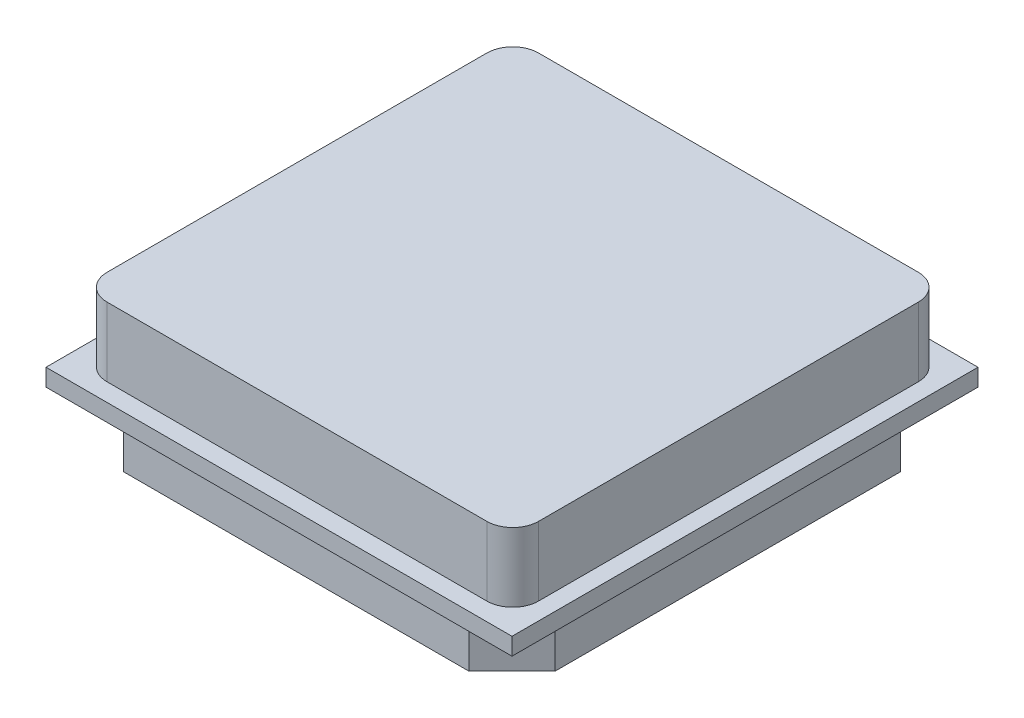
ISO-10303-21;
HEADER;
FILE_DESCRIPTION(('STEP AP214'),'2;1');
FILE_NAME('part.step','',(''),(''),'','','');
FILE_SCHEMA(('AUTOMOTIVE_DESIGN { 1 0 10303 214 1 1 1 1 }'));
ENDSEC;
DATA;
#1=APPLICATION_CONTEXT('core data for automotive mechanical design processes');
#2=APPLICATION_PROTOCOL_DEFINITION('international standard','automotive_design',2000,#1);
#3=PRODUCT_CONTEXT('',#1,'mechanical');
#4=PRODUCT('Part','Part','',(#3));
#5=PRODUCT_RELATED_PRODUCT_CATEGORY('part','',(#4));
#6=PRODUCT_DEFINITION_FORMATION('','',#4);
#7=PRODUCT_DEFINITION_CONTEXT('part definition',#1,'design');
#8=PRODUCT_DEFINITION('design','',#6,#7);
#9=PRODUCT_DEFINITION_SHAPE('','',#8);
#10=(LENGTH_UNIT() NAMED_UNIT(*) SI_UNIT(.MILLI.,.METRE.));
#11=(NAMED_UNIT(*) PLANE_ANGLE_UNIT() SI_UNIT($,.RADIAN.));
#12=(NAMED_UNIT(*) SI_UNIT($,.STERADIAN.) SOLID_ANGLE_UNIT());
#13=UNCERTAINTY_MEASURE_WITH_UNIT(LENGTH_MEASURE(1.E-05),#10,'distance_accuracy_value','');
#14=(GEOMETRIC_REPRESENTATION_CONTEXT(3) GLOBAL_UNCERTAINTY_ASSIGNED_CONTEXT((#13)) GLOBAL_UNIT_ASSIGNED_CONTEXT((#10,
#11,#12)) REPRESENTATION_CONTEXT('',''));
#15=CARTESIAN_POINT('',(0.,0.,0.));
#16=DIRECTION('',(0.,0.,1.));
#17=DIRECTION('',(1.,0.,0.));
#18=AXIS2_PLACEMENT_3D('',#15,#16,#17);
#19=CARTESIAN_POINT('',(-0.757782148578703,17.6518708846178,5.00634006393568));
#20=DIRECTION('',(1.,0.,0.));
#21=DIRECTION('',(0.,0.,-1.));
#22=AXIS2_PLACEMENT_3D('',#19,#20,#21);
#23=PLANE('',#22);
#24=DIRECTION('',(0.,0.,1.));
#25=VECTOR('',#24,1.);
#26=CARTESIAN_POINT('',(-0.757782148578703,17.6518708846178,5.00634006393568));
#27=LINE('',#26,#25);
#28=CARTESIAN_POINT('',(-0.757782148578703,17.6518708846178,6.50634006393568));
#29=VERTEX_POINT('',#28);
#30=CARTESIAN_POINT('',(-0.757782148578703,17.6518708846178,28.5063400639357));
#31=VERTEX_POINT('',#30);
#32=EDGE_CURVE('P0_E102',#29,#31,#27,.T.);
#33=ORIENTED_EDGE('',*,*,#32,.F.);
#34=DIRECTION('',(0.,-1.,0.));
#35=VECTOR('',#34,1.);
#36=CARTESIAN_POINT('',(-0.757782148578703,17.6518708846178,6.50634006393568));
#37=LINE('',#36,#35);
#38=CARTESIAN_POINT('',(-0.757782148578703,13.6518708846178,6.50634006393568));
#39=VERTEX_POINT('',#38);
#40=EDGE_CURVE('P0_E87',#29,#39,#37,.T.);
#41=ORIENTED_EDGE('',*,*,#40,.T.);
#42=DIRECTION('',(0.,0.,1.));
#43=VECTOR('',#42,1.);
#44=CARTESIAN_POINT('',(-0.757782148578703,13.6518708846178,5.00634006393568));
#45=LINE('',#44,#43);
#46=CARTESIAN_POINT('',(-0.757782148578703,13.6518708846178,28.5063400639357));
#47=VERTEX_POINT('',#46);
#48=EDGE_CURVE('P0_E99',#39,#47,#45,.T.);
#49=ORIENTED_EDGE('',*,*,#48,.T.);
#50=DIRECTION('',(0.,-1.,0.));
#51=VECTOR('',#50,1.);
#52=CARTESIAN_POINT('',(-0.757782148578703,17.6518708846178,28.5063400639357));
#53=LINE('',#52,#51);
#54=EDGE_CURVE('P0_E104',#47,#31,#53,.F.);
#55=ORIENTED_EDGE('',*,*,#54,.T.);
#56=EDGE_LOOP('',(#33,#41,#49,#55));
#57=FACE_BOUND('',#56,.T.);
#58=ADVANCED_FACE('P0_F17',(#57),#23,.F.);
#59=CARTESIAN_POINT('',(24.2422178514213,17.6518708846178,30.0063400639357));
#60=DIRECTION('',(0.,0.,-1.));
#61=DIRECTION('',(-1.,0.,0.));
#62=AXIS2_PLACEMENT_3D('',#59,#60,#61);
#63=PLANE('',#62);
#64=DIRECTION('',(1.,0.,0.));
#65=VECTOR('',#64,1.);
#66=CARTESIAN_POINT('',(24.2422178514213,13.6518708846178,30.0063400639357));
#67=LINE('',#66,#65);
#68=CARTESIAN_POINT('',(0.742217851421296,13.6518708846178,30.0063400639357));
#69=VERTEX_POINT('',#68);
#70=CARTESIAN_POINT('',(22.7422178514213,13.6518708846178,30.0063400639357));
#71=VERTEX_POINT('',#70);
#72=EDGE_CURVE('P0_E108',#69,#71,#67,.T.);
#73=ORIENTED_EDGE('',*,*,#72,.T.);
#74=DIRECTION('',(0.,-1.,0.));
#75=VECTOR('',#74,1.);
#76=CARTESIAN_POINT('',(22.7422178514213,17.6518708846178,30.0063400639357));
#77=LINE('',#76,#75);
#78=CARTESIAN_POINT('',(22.7422178514213,17.6518708846178,30.0063400639357));
#79=VERTEX_POINT('',#78);
#80=EDGE_CURVE('P0_E11',#71,#79,#77,.F.);
#81=ORIENTED_EDGE('',*,*,#80,.T.);
#82=DIRECTION('',(1.,0.,0.));
#83=VECTOR('',#82,1.);
#84=CARTESIAN_POINT('',(24.2422178514213,17.6518708846178,30.0063400639357));
#85=LINE('',#84,#83);
#86=CARTESIAN_POINT('',(0.742217851421296,17.6518708846178,30.0063400639357));
#87=VERTEX_POINT('',#86);
#88=EDGE_CURVE('P0_E144',#87,#79,#85,.T.);
#89=ORIENTED_EDGE('',*,*,#88,.F.);
#90=DIRECTION('',(0.,-1.,0.));
#91=VECTOR('',#90,1.);
#92=CARTESIAN_POINT('',(0.742217851421296,17.6518708846178,30.0063400639357));
#93=LINE('',#92,#91);
#94=EDGE_CURVE('P0_E25',#87,#69,#93,.T.);
#95=ORIENTED_EDGE('',*,*,#94,.T.);
#96=EDGE_LOOP('',(#73,#81,#89,#95));
#97=FACE_BOUND('',#96,.T.);
#98=ADVANCED_FACE('P0_F142',(#97),#63,.F.);
#99=CARTESIAN_POINT('',(24.2422178514213,17.6518708846178,5.00634006393568));
#100=DIRECTION('',(-1.,0.,0.));
#101=DIRECTION('',(0.,0.,1.));
#102=AXIS2_PLACEMENT_3D('',#99,#100,#101);
#103=PLANE('',#102);
#104=DIRECTION('',(0.,0.,-1.));
#105=VECTOR('',#104,1.);
#106=CARTESIAN_POINT('',(24.2422178514213,13.6518708846178,5.00634006393568));
#107=LINE('',#106,#105);
#108=CARTESIAN_POINT('',(24.2422178514213,13.6518708846178,28.5063400639357));
#109=VERTEX_POINT('',#108);
#110=CARTESIAN_POINT('',(24.2422178514213,13.6518708846178,6.50634006393568));
#111=VERTEX_POINT('',#110);
#112=EDGE_CURVE('P0_E111',#109,#111,#107,.T.);
#113=ORIENTED_EDGE('',*,*,#112,.T.);
#114=DIRECTION('',(0.,-1.,0.));
#115=VECTOR('',#114,1.);
#116=CARTESIAN_POINT('',(24.2422178514213,17.6518708846178,6.50634006393568));
#117=LINE('',#116,#115);
#118=CARTESIAN_POINT('',(24.2422178514213,17.6518708846178,6.50634006393568));
#119=VERTEX_POINT('',#118);
#120=EDGE_CURVE('P0_E32',#111,#119,#117,.F.);
#121=ORIENTED_EDGE('',*,*,#120,.T.);
#122=DIRECTION('',(0.,0.,-1.));
#123=VECTOR('',#122,1.);
#124=CARTESIAN_POINT('',(24.2422178514213,17.6518708846178,5.00634006393568));
#125=LINE('',#124,#123);
#126=CARTESIAN_POINT('',(24.2422178514213,17.6518708846178,28.5063400639357));
#127=VERTEX_POINT('',#126);
#128=EDGE_CURVE('P0_E152',#127,#119,#125,.T.);
#129=ORIENTED_EDGE('',*,*,#128,.F.);
#130=DIRECTION('',(0.,-1.,0.));
#131=VECTOR('',#130,1.);
#132=CARTESIAN_POINT('',(24.2422178514213,17.6518708846178,28.5063400639357));
#133=LINE('',#132,#131);
#134=EDGE_CURVE('P0_E135',#127,#109,#133,.T.);
#135=ORIENTED_EDGE('',*,*,#134,.T.);
#136=EDGE_LOOP('',(#113,#121,#129,#135));
#137=FACE_BOUND('',#136,.T.);
#138=ADVANCED_FACE('P0_F151',(#137),#103,.F.);
#139=CARTESIAN_POINT('',(24.2422178514213,17.6518708846178,5.00634006393568));
#140=DIRECTION('',(0.,0.,1.));
#141=DIRECTION('',(1.,0.,0.));
#142=AXIS2_PLACEMENT_3D('',#139,#140,#141);
#143=PLANE('',#142);
#144=DIRECTION('',(-1.,0.,0.));
#145=VECTOR('',#144,1.);
#146=CARTESIAN_POINT('',(24.2422178514213,13.6518708846178,5.00634006393568));
#147=LINE('',#146,#145);
#148=CARTESIAN_POINT('',(22.7422178514213,13.6518708846178,5.00634006393568));
#149=VERTEX_POINT('',#148);
#150=CARTESIAN_POINT('',(0.742217851421296,13.6518708846178,5.00634006393568));
#151=VERTEX_POINT('',#150);
#152=EDGE_CURVE('P0_E118',#149,#151,#147,.T.);
#153=ORIENTED_EDGE('',*,*,#152,.T.);
#154=DIRECTION('',(0.,-1.,0.));
#155=VECTOR('',#154,1.);
#156=CARTESIAN_POINT('',(0.742217851421296,17.6518708846178,5.00634006393568));
#157=LINE('',#156,#155);
#158=CARTESIAN_POINT('',(0.742217851421296,17.6518708846178,5.00634006393568));
#159=VERTEX_POINT('',#158);
#160=EDGE_CURVE('P0_E88',#151,#159,#157,.F.);
#161=ORIENTED_EDGE('',*,*,#160,.T.);
#162=DIRECTION('',(-1.,0.,0.));
#163=VECTOR('',#162,1.);
#164=CARTESIAN_POINT('',(24.2422178514213,17.6518708846178,5.00634006393568));
#165=LINE('',#164,#163);
#166=CARTESIAN_POINT('',(22.7422178514213,17.6518708846178,5.00634006393568));
#167=VERTEX_POINT('',#166);
#168=EDGE_CURVE('P0_E114',#167,#159,#165,.T.);
#169=ORIENTED_EDGE('',*,*,#168,.F.);
#170=DIRECTION('',(0.,-1.,0.));
#171=VECTOR('',#170,1.);
#172=CARTESIAN_POINT('',(22.7422178514213,17.6518708846178,5.00634006393568));
#173=LINE('',#172,#171);
#174=EDGE_CURVE('P0_E93',#167,#149,#173,.T.);
#175=ORIENTED_EDGE('',*,*,#174,.T.);
#176=EDGE_LOOP('',(#153,#161,#169,#175));
#177=FACE_BOUND('',#176,.T.);
#178=ADVANCED_FACE('P0_F181',(#177),#143,.F.);
#179=CARTESIAN_POINT('',(11.7422178514213,17.6518708846178,17.5063400639357));
#180=DIRECTION('',(0.,-1.,0.));
#181=DIRECTION('',(0.,0.,-1.));
#182=AXIS2_PLACEMENT_3D('',#179,#180,#181);
#183=PLANE('',#182);
#184=ORIENTED_EDGE('',*,*,#168,.T.);
#185=CARTESIAN_POINT('',(0.742217851421296,17.6518708846178,6.50634006393568));
#186=DIRECTION('',(0.,-1.,0.));
#187=DIRECTION('',(0.,0.,-1.));
#188=AXIS2_PLACEMENT_3D('',#185,#186,#187);
#189=CIRCLE('',#188,1.5);
#190=EDGE_CURVE('P0_E133',#159,#29,#189,.F.);
#191=ORIENTED_EDGE('',*,*,#190,.T.);
#192=ORIENTED_EDGE('',*,*,#32,.T.);
#193=CARTESIAN_POINT('',(0.742217851421296,17.6518708846178,28.5063400639357));
#194=DIRECTION('',(0.,-1.,0.));
#195=DIRECTION('',(0.,0.,-1.));
#196=AXIS2_PLACEMENT_3D('',#193,#194,#195);
#197=CIRCLE('',#196,1.5);
#198=EDGE_CURVE('P0_E128',#31,#87,#197,.F.);
#199=ORIENTED_EDGE('',*,*,#198,.T.);
#200=ORIENTED_EDGE('',*,*,#88,.T.);
#201=CARTESIAN_POINT('',(22.7422178514213,17.6518708846178,28.5063400639357));
#202=DIRECTION('',(0.,-1.,0.));
#203=DIRECTION('',(0.,0.,-1.));
#204=AXIS2_PLACEMENT_3D('',#201,#202,#203);
#205=CIRCLE('',#204,1.5);
#206=EDGE_CURVE('P0_E39',#79,#127,#205,.F.);
#207=ORIENTED_EDGE('',*,*,#206,.T.);
#208=ORIENTED_EDGE('',*,*,#128,.T.);
#209=CARTESIAN_POINT('',(22.7422178514213,17.6518708846178,6.50634006393568));
#210=DIRECTION('',(0.,-1.,0.));
#211=DIRECTION('',(0.,0.,-1.));
#212=AXIS2_PLACEMENT_3D('',#209,#210,#211);
#213=CIRCLE('',#212,1.5);
#214=EDGE_CURVE('P0_E131',#119,#167,#213,.F.);
#215=ORIENTED_EDGE('',*,*,#214,.T.);
#216=EDGE_LOOP('',(#184,#191,#192,#199,#200,#207,#208,#215));
#217=FACE_BOUND('',#216,.T.);
#218=ADVANCED_FACE('P0_F157',(#217),#183,.F.);
#219=CARTESIAN_POINT('',(11.7422178514213,13.6518708846178,17.5063400639357));
#220=DIRECTION('',(0.,-1.,0.));
#221=DIRECTION('',(0.,0.,-1.));
#222=AXIS2_PLACEMENT_3D('',#219,#220,#221);
#223=PLANE('',#222);
#224=ORIENTED_EDGE('',*,*,#48,.F.);
#225=CARTESIAN_POINT('',(0.742217851421296,13.6518708846178,6.50634006393568));
#226=DIRECTION('',(0.,-1.,0.));
#227=DIRECTION('',(0.,0.,-1.));
#228=AXIS2_PLACEMENT_3D('',#225,#226,#227);
#229=CIRCLE('',#228,1.5);
#230=EDGE_CURVE('P0_E83',#39,#151,#229,.T.);
#231=ORIENTED_EDGE('',*,*,#230,.T.);
#232=ORIENTED_EDGE('',*,*,#152,.F.);
#233=CARTESIAN_POINT('',(22.7422178514213,13.6518708846178,6.50634006393568));
#234=DIRECTION('',(0.,-1.,0.));
#235=DIRECTION('',(0.,0.,-1.));
#236=AXIS2_PLACEMENT_3D('',#233,#234,#235);
#237=CIRCLE('',#236,1.5);
#238=EDGE_CURVE('P0_E94',#149,#111,#237,.T.);
#239=ORIENTED_EDGE('',*,*,#238,.T.);
#240=ORIENTED_EDGE('',*,*,#112,.F.);
#241=CARTESIAN_POINT('',(22.7422178514213,13.6518708846178,28.5063400639357));
#242=DIRECTION('',(0.,-1.,0.));
#243=DIRECTION('',(0.,0.,-1.));
#244=AXIS2_PLACEMENT_3D('',#241,#242,#243);
#245=CIRCLE('',#244,1.5);
#246=EDGE_CURVE('P0_E122',#109,#71,#245,.T.);
#247=ORIENTED_EDGE('',*,*,#246,.T.);
#248=ORIENTED_EDGE('',*,*,#72,.F.);
#249=CARTESIAN_POINT('',(0.742217851421296,13.6518708846178,28.5063400639357));
#250=DIRECTION('',(0.,-1.,0.));
#251=DIRECTION('',(0.,0.,-1.));
#252=AXIS2_PLACEMENT_3D('',#249,#250,#251);
#253=CIRCLE('',#252,1.5);
#254=EDGE_CURVE('P0_E103',#69,#47,#253,.T.);
#255=ORIENTED_EDGE('',*,*,#254,.T.);
#256=EDGE_LOOP('',(#224,#231,#232,#239,#240,#247,#248,#255));
#257=FACE_BOUND('',#256,.T.);
#258=ADVANCED_FACE('P0_F106',(#257),#223,.T.);
#259=CARTESIAN_POINT('',(0.742217851421296,17.6518708846178,6.50634006393568));
#260=DIRECTION('',(0.,-1.,0.));
#261=DIRECTION('',(0.,0.,-1.));
#262=AXIS2_PLACEMENT_3D('',#259,#260,#261);
#263=CYLINDRICAL_SURFACE('',#262,1.5);
#264=ORIENTED_EDGE('',*,*,#190,.F.);
#265=ORIENTED_EDGE('',*,*,#160,.F.);
#266=ORIENTED_EDGE('',*,*,#230,.F.);
#267=ORIENTED_EDGE('',*,*,#40,.F.);
#268=EDGE_LOOP('',(#264,#265,#266,#267));
#269=FACE_BOUND('',#268,.T.);
#270=ADVANCED_FACE('P0_F86',(#269),#263,.T.);
#271=CARTESIAN_POINT('',(22.7422178514213,17.6518708846178,6.50634006393568));
#272=DIRECTION('',(0.,-1.,0.));
#273=DIRECTION('',(0.,0.,-1.));
#274=AXIS2_PLACEMENT_3D('',#271,#272,#273);
#275=CYLINDRICAL_SURFACE('',#274,1.5);
#276=ORIENTED_EDGE('',*,*,#214,.F.);
#277=ORIENTED_EDGE('',*,*,#120,.F.);
#278=ORIENTED_EDGE('',*,*,#238,.F.);
#279=ORIENTED_EDGE('',*,*,#174,.F.);
#280=EDGE_LOOP('',(#276,#277,#278,#279));
#281=FACE_BOUND('',#280,.T.);
#282=ADVANCED_FACE('P0_F163',(#281),#275,.T.);
#283=CARTESIAN_POINT('',(22.7422178514213,17.6518708846178,28.5063400639357));
#284=DIRECTION('',(0.,-1.,0.));
#285=DIRECTION('',(0.,0.,-1.));
#286=AXIS2_PLACEMENT_3D('',#283,#284,#285);
#287=CYLINDRICAL_SURFACE('',#286,1.5);
#288=ORIENTED_EDGE('',*,*,#206,.F.);
#289=ORIENTED_EDGE('',*,*,#80,.F.);
#290=ORIENTED_EDGE('',*,*,#246,.F.);
#291=ORIENTED_EDGE('',*,*,#134,.F.);
#292=EDGE_LOOP('',(#288,#289,#290,#291));
#293=FACE_BOUND('',#292,.T.);
#294=ADVANCED_FACE('P0_F150',(#293),#287,.T.);
#295=CARTESIAN_POINT('',(0.742217851421296,17.6518708846178,28.5063400639357));
#296=DIRECTION('',(0.,-1.,0.));
#297=DIRECTION('',(0.,0.,-1.));
#298=AXIS2_PLACEMENT_3D('',#295,#296,#297);
#299=CYLINDRICAL_SURFACE('',#298,1.5);
#300=ORIENTED_EDGE('',*,*,#198,.F.);
#301=ORIENTED_EDGE('',*,*,#54,.F.);
#302=ORIENTED_EDGE('',*,*,#254,.F.);
#303=ORIENTED_EDGE('',*,*,#94,.F.);
#304=EDGE_LOOP('',(#300,#301,#302,#303));
#305=FACE_BOUND('',#304,.T.);
#306=ADVANCED_FACE('P0_F19',(#305),#299,.T.);
#307=CLOSED_SHELL('',(#58,#98,#138,#178,#218,#258,#270,#282,#294,#306));
#308=MANIFOLD_SOLID_BREP('P0_B1',#307);
#309=CARTESIAN_POINT('',(11.739074513285,12.6518708846179,17.5436583583481));
#310=DIRECTION('',(0.,-1.,0.));
#311=DIRECTION('',(0.,0.,1.));
#312=AXIS2_PLACEMENT_3D('',#309,#310,#311);
#313=PLANE('',#312);
#314=DIRECTION('',(0.,0.,-1.));
#315=VECTOR('',#314,1.);
#316=CARTESIAN_POINT('',(-1.76092548671503,12.6518708846179,4.0436583583481));
#317=LINE('',#316,#315);
#318=CARTESIAN_POINT('',(-1.76092548671504,12.6518708846179,31.0436583583481));
#319=VERTEX_POINT('',#318);
#320=CARTESIAN_POINT('',(-1.76092548671503,12.6518708846179,4.0436583583481));
#321=VERTEX_POINT('',#320);
#322=EDGE_CURVE('P1_E115',#319,#321,#317,.T.);
#323=ORIENTED_EDGE('',*,*,#322,.T.);
#324=DIRECTION('',(1.,0.,0.));
#325=VECTOR('',#324,1.);
#326=CARTESIAN_POINT('',(25.239074513285,12.6518708846179,4.04365835834809));
#327=LINE('',#326,#325);
#328=CARTESIAN_POINT('',(25.239074513285,12.6518708846179,4.04365835834809));
#329=VERTEX_POINT('',#328);
#330=EDGE_CURVE('P1_E104',#321,#329,#327,.T.);
#331=ORIENTED_EDGE('',*,*,#330,.T.);
#332=DIRECTION('',(0.,0.,1.));
#333=VECTOR('',#332,1.);
#334=CARTESIAN_POINT('',(25.239074513285,12.6518708846179,4.04365835834809));
#335=LINE('',#334,#333);
#336=CARTESIAN_POINT('',(25.239074513285,12.6518708846179,31.0436583583481));
#337=VERTEX_POINT('',#336);
#338=EDGE_CURVE('P1_E114',#329,#337,#335,.T.);
#339=ORIENTED_EDGE('',*,*,#338,.T.);
#340=DIRECTION('',(-1.,0.,0.));
#341=VECTOR('',#340,1.);
#342=CARTESIAN_POINT('',(25.239074513285,12.6518708846179,31.0436583583481));
#343=LINE('',#342,#341);
#344=EDGE_CURVE('P1_E119',#337,#319,#343,.T.);
#345=ORIENTED_EDGE('',*,*,#344,.T.);
#346=EDGE_LOOP('',(#323,#331,#339,#345));
#347=FACE_BOUND('',#346,.T.);
#348=DIRECTION('',(1.,0.,0.));
#349=VECTOR('',#348,1.);
#350=CARTESIAN_POINT('',(24.239074513285,12.6518708846179,5.0436583583481));
#351=LINE('',#350,#349);
#352=CARTESIAN_POINT('',(1.73907451328496,12.6518708846179,5.0436583583481));
#353=VERTEX_POINT('',#352);
#354=CARTESIAN_POINT('',(21.739074513285,12.6518708846179,5.0436583583481));
#355=VERTEX_POINT('',#354);
#356=EDGE_CURVE('P1_E167',#353,#355,#351,.T.);
#357=ORIENTED_EDGE('',*,*,#356,.F.);
#358=DIRECTION('',(0.707106781186546,0.,-0.707106781186549));
#359=VECTOR('',#358,1.);
#360=CARTESIAN_POINT('',(1.73907451328496,12.6518708846179,5.0436583583481));
#361=LINE('',#360,#359);
#362=CARTESIAN_POINT('',(-0.760925486715035,12.6518708846179,7.5436583583481));
#363=VERTEX_POINT('',#362);
#364=EDGE_CURVE('P1_E162',#353,#363,#361,.F.);
#365=ORIENTED_EDGE('',*,*,#364,.T.);
#366=DIRECTION('',(0.,0.,-1.));
#367=VECTOR('',#366,1.);
#368=CARTESIAN_POINT('',(-0.760925486715035,12.6518708846179,5.0436583583481));
#369=LINE('',#368,#367);
#370=CARTESIAN_POINT('',(-0.760925486715039,12.6518708846179,27.5436583583481));
#371=VERTEX_POINT('',#370);
#372=EDGE_CURVE('P1_E165',#371,#363,#369,.T.);
#373=ORIENTED_EDGE('',*,*,#372,.F.);
#374=DIRECTION('',(-0.707106781186549,0.,-0.707106781186546));
#375=VECTOR('',#374,1.);
#376=CARTESIAN_POINT('',(-0.760925486715039,12.6518708846179,27.5436583583481));
#377=LINE('',#376,#375);
#378=CARTESIAN_POINT('',(1.73907451328498,12.6518708846179,30.0436583583481));
#379=VERTEX_POINT('',#378);
#380=EDGE_CURVE('P1_E24',#371,#379,#377,.F.);
#381=ORIENTED_EDGE('',*,*,#380,.T.);
#382=DIRECTION('',(-1.,0.,0.));
#383=VECTOR('',#382,1.);
#384=CARTESIAN_POINT('',(24.239074513285,12.6518708846179,30.0436583583481));
#385=LINE('',#384,#383);
#386=CARTESIAN_POINT('',(21.739074513285,12.6518708846179,30.0436583583481));
#387=VERTEX_POINT('',#386);
#388=EDGE_CURVE('P1_E194',#387,#379,#385,.T.);
#389=ORIENTED_EDGE('',*,*,#388,.F.);
#390=DIRECTION('',(-0.707106781186546,0.,0.707106781186549));
#391=VECTOR('',#390,1.);
#392=CARTESIAN_POINT('',(21.739074513285,12.6518708846179,30.0436583583481));
#393=LINE('',#392,#391);
#394=CARTESIAN_POINT('',(24.239074513285,12.6518708846179,27.5436583583481));
#395=VERTEX_POINT('',#394);
#396=EDGE_CURVE('P1_E10',#387,#395,#393,.F.);
#397=ORIENTED_EDGE('',*,*,#396,.T.);
#398=DIRECTION('',(0.,0.,1.));
#399=VECTOR('',#398,1.);
#400=CARTESIAN_POINT('',(24.239074513285,12.6518708846179,5.0436583583481));
#401=LINE('',#400,#399);
#402=CARTESIAN_POINT('',(24.239074513285,12.6518708846179,7.54365835834809));
#403=VERTEX_POINT('',#402);
#404=EDGE_CURVE('P1_E200',#403,#395,#401,.T.);
#405=ORIENTED_EDGE('',*,*,#404,.F.);
#406=DIRECTION('',(0.707106781186549,0.,0.707106781186547));
#407=VECTOR('',#406,1.);
#408=CARTESIAN_POINT('',(24.239074513285,12.6518708846179,7.54365835834809));
#409=LINE('',#408,#407);
#410=EDGE_CURVE('P1_E160',#403,#355,#409,.F.);
#411=ORIENTED_EDGE('',*,*,#410,.T.);
#412=EDGE_LOOP('',(#357,#365,#373,#381,#389,#397,#405,#411));
#413=FACE_BOUND('',#412,.T.);
#414=ADVANCED_FACE('P1_F16',(#347,#413),#313,.T.);
#415=CARTESIAN_POINT('',(-1.76092548671503,12.6518708846179,4.0436583583481));
#416=DIRECTION('',(1.,0.,0.));
#417=DIRECTION('',(0.,0.,1.));
#418=AXIS2_PLACEMENT_3D('',#415,#416,#417);
#419=PLANE('',#418);
#420=DIRECTION('',(0.,0.,-1.));
#421=VECTOR('',#420,1.);
#422=CARTESIAN_POINT('',(-1.76092548671503,13.6518708846179,4.0436583583481));
#423=LINE('',#422,#421);
#424=CARTESIAN_POINT('',(-1.76092548671504,13.6518708846179,31.0436583583481));
#425=VERTEX_POINT('',#424);
#426=CARTESIAN_POINT('',(-1.76092548671503,13.6518708846179,4.0436583583481));
#427=VERTEX_POINT('',#426);
#428=EDGE_CURVE('P1_E127',#425,#427,#423,.T.);
#429=ORIENTED_EDGE('',*,*,#428,.T.);
#430=DIRECTION('',(0.,1.,0.));
#431=VECTOR('',#430,1.);
#432=CARTESIAN_POINT('',(-1.76092548671503,12.6518708846179,4.0436583583481));
#433=LINE('',#432,#431);
#434=EDGE_CURVE('P1_E108',#321,#427,#433,.T.);
#435=ORIENTED_EDGE('',*,*,#434,.F.);
#436=ORIENTED_EDGE('',*,*,#322,.F.);
#437=DIRECTION('',(0.,1.,0.));
#438=VECTOR('',#437,1.);
#439=CARTESIAN_POINT('',(-1.76092548671504,12.6518708846179,31.0436583583481));
#440=LINE('',#439,#438);
#441=EDGE_CURVE('P1_E206',#319,#425,#440,.T.);
#442=ORIENTED_EDGE('',*,*,#441,.T.);
#443=EDGE_LOOP('',(#429,#435,#436,#442));
#444=FACE_BOUND('',#443,.T.);
#445=ADVANCED_FACE('P1_F125',(#444),#419,.F.);
#446=CARTESIAN_POINT('',(25.239074513285,12.6518708846179,4.04365835834809));
#447=DIRECTION('',(0.,0.,1.));
#448=DIRECTION('',(-1.,0.,0.));
#449=AXIS2_PLACEMENT_3D('',#446,#447,#448);
#450=PLANE('',#449);
#451=DIRECTION('',(1.,0.,0.));
#452=VECTOR('',#451,1.);
#453=CARTESIAN_POINT('',(25.239074513285,13.6518708846179,4.04365835834809));
#454=LINE('',#453,#452);
#455=CARTESIAN_POINT('',(25.239074513285,13.6518708846179,4.04365835834809));
#456=VERTEX_POINT('',#455);
#457=EDGE_CURVE('P1_E208',#427,#456,#454,.T.);
#458=ORIENTED_EDGE('',*,*,#457,.T.);
#459=DIRECTION('',(0.,1.,0.));
#460=VECTOR('',#459,1.);
#461=CARTESIAN_POINT('',(25.239074513285,12.6518708846179,4.04365835834809));
#462=LINE('',#461,#460);
#463=EDGE_CURVE('P1_E111',#329,#456,#462,.T.);
#464=ORIENTED_EDGE('',*,*,#463,.F.);
#465=ORIENTED_EDGE('',*,*,#330,.F.);
#466=ORIENTED_EDGE('',*,*,#434,.T.);
#467=EDGE_LOOP('',(#458,#464,#465,#466));
#468=FACE_BOUND('',#467,.T.);
#469=ADVANCED_FACE('P1_F106',(#468),#450,.F.);
#470=CARTESIAN_POINT('',(25.239074513285,12.6518708846179,4.04365835834809));
#471=DIRECTION('',(-1.,0.,0.));
#472=DIRECTION('',(0.,0.,-1.));
#473=AXIS2_PLACEMENT_3D('',#470,#471,#472);
#474=PLANE('',#473);
#475=DIRECTION('',(0.,0.,1.));
#476=VECTOR('',#475,1.);
#477=CARTESIAN_POINT('',(25.239074513285,13.6518708846179,4.04365835834809));
#478=LINE('',#477,#476);
#479=CARTESIAN_POINT('',(25.239074513285,13.6518708846179,31.0436583583481));
#480=VERTEX_POINT('',#479);
#481=EDGE_CURVE('P1_E210',#456,#480,#478,.T.);
#482=ORIENTED_EDGE('',*,*,#481,.T.);
#483=DIRECTION('',(0.,1.,0.));
#484=VECTOR('',#483,1.);
#485=CARTESIAN_POINT('',(25.239074513285,12.6518708846179,31.0436583583481));
#486=LINE('',#485,#484);
#487=EDGE_CURVE('P1_E132',#337,#480,#486,.T.);
#488=ORIENTED_EDGE('',*,*,#487,.F.);
#489=ORIENTED_EDGE('',*,*,#338,.F.);
#490=ORIENTED_EDGE('',*,*,#463,.T.);
#491=EDGE_LOOP('',(#482,#488,#489,#490));
#492=FACE_BOUND('',#491,.T.);
#493=ADVANCED_FACE('P1_F222',(#492),#474,.F.);
#494=CARTESIAN_POINT('',(25.239074513285,12.6518708846179,31.0436583583481));
#495=DIRECTION('',(0.,0.,-1.));
#496=DIRECTION('',(1.,0.,0.));
#497=AXIS2_PLACEMENT_3D('',#494,#495,#496);
#498=PLANE('',#497);
#499=DIRECTION('',(-1.,0.,0.));
#500=VECTOR('',#499,1.);
#501=CARTESIAN_POINT('',(25.239074513285,13.6518708846179,31.0436583583481));
#502=LINE('',#501,#500);
#503=EDGE_CURVE('P1_E123',#480,#425,#502,.T.);
#504=ORIENTED_EDGE('',*,*,#503,.T.);
#505=ORIENTED_EDGE('',*,*,#441,.F.);
#506=ORIENTED_EDGE('',*,*,#344,.F.);
#507=ORIENTED_EDGE('',*,*,#487,.T.);
#508=EDGE_LOOP('',(#504,#505,#506,#507));
#509=FACE_BOUND('',#508,.T.);
#510=ADVANCED_FACE('P1_F217',(#509),#498,.F.);
#511=CARTESIAN_POINT('',(11.739074513285,13.6518708846179,17.5436583583481));
#512=DIRECTION('',(0.,-1.,0.));
#513=DIRECTION('',(0.,0.,1.));
#514=AXIS2_PLACEMENT_3D('',#511,#512,#513);
#515=PLANE('',#514);
#516=ORIENTED_EDGE('',*,*,#428,.F.);
#517=ORIENTED_EDGE('',*,*,#503,.F.);
#518=ORIENTED_EDGE('',*,*,#481,.F.);
#519=ORIENTED_EDGE('',*,*,#457,.F.);
#520=EDGE_LOOP('',(#516,#517,#518,#519));
#521=FACE_BOUND('',#520,.T.);
#522=ADVANCED_FACE('P1_F221',(#521),#515,.F.);
#523=CARTESIAN_POINT('',(-0.760925486715035,9.65187088461785,5.0436583583481));
#524=DIRECTION('',(1.,0.,0.));
#525=DIRECTION('',(0.,0.,1.));
#526=AXIS2_PLACEMENT_3D('',#523,#524,#525);
#527=PLANE('',#526);
#528=ORIENTED_EDGE('',*,*,#372,.T.);
#529=DIRECTION('',(0.,-1.,0.));
#530=VECTOR('',#529,1.);
#531=CARTESIAN_POINT('',(-0.760925486715035,9.65187088461785,7.5436583583481));
#532=LINE('',#531,#530);
#533=CARTESIAN_POINT('',(-0.760925486715035,9.65187088461785,7.5436583583481));
#534=VERTEX_POINT('',#533);
#535=EDGE_CURVE('P1_E154',#363,#534,#532,.T.);
#536=ORIENTED_EDGE('',*,*,#535,.T.);
#537=DIRECTION('',(0.,0.,-1.));
#538=VECTOR('',#537,1.);
#539=CARTESIAN_POINT('',(-0.760925486715035,9.65187088461785,5.0436583583481));
#540=LINE('',#539,#538);
#541=CARTESIAN_POINT('',(-0.760925486715039,9.65187088461785,27.5436583583481));
#542=VERTEX_POINT('',#541);
#543=EDGE_CURVE('P1_E185',#542,#534,#540,.T.);
#544=ORIENTED_EDGE('',*,*,#543,.F.);
#545=DIRECTION('',(0.,1.,0.));
#546=VECTOR('',#545,1.);
#547=CARTESIAN_POINT('',(-0.760925486715039,9.65187088461785,27.5436583583481));
#548=LINE('',#547,#546);
#549=EDGE_CURVE('P1_E151',#542,#371,#548,.T.);
#550=ORIENTED_EDGE('',*,*,#549,.T.);
#551=EDGE_LOOP('',(#528,#536,#544,#550));
#552=FACE_BOUND('',#551,.T.);
#553=ADVANCED_FACE('P1_F172',(#552),#527,.F.);
#554=CARTESIAN_POINT('',(24.239074513285,9.65187088461785,5.0436583583481));
#555=DIRECTION('',(0.,0.,1.));
#556=DIRECTION('',(-1.,0.,0.));
#557=AXIS2_PLACEMENT_3D('',#554,#555,#556);
#558=PLANE('',#557);
#559=ORIENTED_EDGE('',*,*,#356,.T.);
#560=DIRECTION('',(0.,-1.,0.));
#561=VECTOR('',#560,1.);
#562=CARTESIAN_POINT('',(21.739074513285,9.65187088461785,5.0436583583481));
#563=LINE('',#562,#561);
#564=CARTESIAN_POINT('',(21.739074513285,9.65187088461785,5.0436583583481));
#565=VERTEX_POINT('',#564);
#566=EDGE_CURVE('P1_E141',#355,#565,#563,.T.);
#567=ORIENTED_EDGE('',*,*,#566,.T.);
#568=DIRECTION('',(1.,0.,0.));
#569=VECTOR('',#568,1.);
#570=CARTESIAN_POINT('',(24.239074513285,9.65187088461785,5.0436583583481));
#571=LINE('',#570,#569);
#572=CARTESIAN_POINT('',(1.73907451328496,9.65187088461785,5.0436583583481));
#573=VERTEX_POINT('',#572);
#574=EDGE_CURVE('P1_E183',#573,#565,#571,.T.);
#575=ORIENTED_EDGE('',*,*,#574,.F.);
#576=DIRECTION('',(0.,1.,0.));
#577=VECTOR('',#576,1.);
#578=CARTESIAN_POINT('',(1.73907451328496,9.65187088461785,5.0436583583481));
#579=LINE('',#578,#577);
#580=EDGE_CURVE('P1_E138',#573,#353,#579,.T.);
#581=ORIENTED_EDGE('',*,*,#580,.T.);
#582=EDGE_LOOP('',(#559,#567,#575,#581));
#583=FACE_BOUND('',#582,.T.);
#584=ADVANCED_FACE('P1_F187',(#583),#558,.F.);
#585=CARTESIAN_POINT('',(24.239074513285,9.65187088461785,5.0436583583481));
#586=DIRECTION('',(-1.,0.,0.));
#587=DIRECTION('',(0.,0.,-1.));
#588=AXIS2_PLACEMENT_3D('',#585,#586,#587);
#589=PLANE('',#588);
#590=DIRECTION('',(0.,0.,1.));
#591=VECTOR('',#590,1.);
#592=CARTESIAN_POINT('',(24.239074513285,9.65187088461785,5.0436583583481));
#593=LINE('',#592,#591);
#594=CARTESIAN_POINT('',(24.239074513285,9.65187088461785,7.54365835834808));
#595=VERTEX_POINT('',#594);
#596=CARTESIAN_POINT('',(24.239074513285,9.65187088461785,27.5436583583481));
#597=VERTEX_POINT('',#596);
#598=EDGE_CURVE('P1_E189',#595,#597,#593,.T.);
#599=ORIENTED_EDGE('',*,*,#598,.F.);
#600=DIRECTION('',(0.,1.,0.));
#601=VECTOR('',#600,1.);
#602=CARTESIAN_POINT('',(24.239074513285,9.65187088461785,7.54365835834809));
#603=LINE('',#602,#601);
#604=EDGE_CURVE('P1_E130',#595,#403,#603,.T.);
#605=ORIENTED_EDGE('',*,*,#604,.T.);
#606=ORIENTED_EDGE('',*,*,#404,.T.);
#607=DIRECTION('',(0.,-1.,0.));
#608=VECTOR('',#607,1.);
#609=CARTESIAN_POINT('',(24.239074513285,9.65187088461785,27.5436583583481));
#610=LINE('',#609,#608);
#611=EDGE_CURVE('P1_E128',#395,#597,#610,.T.);
#612=ORIENTED_EDGE('',*,*,#611,.T.);
#613=EDGE_LOOP('',(#599,#605,#606,#612));
#614=FACE_BOUND('',#613,.T.);
#615=ADVANCED_FACE('P1_F248',(#614),#589,.F.);
#616=CARTESIAN_POINT('',(24.239074513285,9.65187088461785,30.0436583583481));
#617=DIRECTION('',(0.,0.,-1.));
#618=DIRECTION('',(1.,0.,0.));
#619=AXIS2_PLACEMENT_3D('',#616,#617,#618);
#620=PLANE('',#619);
#621=ORIENTED_EDGE('',*,*,#388,.T.);
#622=DIRECTION('',(0.,-1.,0.));
#623=VECTOR('',#622,1.);
#624=CARTESIAN_POINT('',(1.73907451328498,9.65187088461785,30.0436583583481));
#625=LINE('',#624,#623);
#626=CARTESIAN_POINT('',(1.73907451328498,9.65187088461785,30.0436583583481));
#627=VERTEX_POINT('',#626);
#628=EDGE_CURVE('P1_E158',#379,#627,#625,.T.);
#629=ORIENTED_EDGE('',*,*,#628,.T.);
#630=DIRECTION('',(-1.,0.,0.));
#631=VECTOR('',#630,1.);
#632=CARTESIAN_POINT('',(24.239074513285,9.65187088461785,30.0436583583481));
#633=LINE('',#632,#631);
#634=CARTESIAN_POINT('',(21.739074513285,9.65187088461785,30.0436583583481));
#635=VERTEX_POINT('',#634);
#636=EDGE_CURVE('P1_E192',#635,#627,#633,.T.);
#637=ORIENTED_EDGE('',*,*,#636,.F.);
#638=DIRECTION('',(0.,1.,0.));
#639=VECTOR('',#638,1.);
#640=CARTESIAN_POINT('',(21.739074513285,9.65187088461785,30.0436583583481));
#641=LINE('',#640,#639);
#642=EDGE_CURVE('P1_E156',#635,#387,#641,.T.);
#643=ORIENTED_EDGE('',*,*,#642,.T.);
#644=EDGE_LOOP('',(#621,#629,#637,#643));
#645=FACE_BOUND('',#644,.T.);
#646=ADVANCED_FACE('P1_F252',(#645),#620,.F.);
#647=CARTESIAN_POINT('',(11.739074513285,9.65187088461785,17.5436583583481));
#648=DIRECTION('',(0.,-1.,0.));
#649=DIRECTION('',(0.,0.,1.));
#650=AXIS2_PLACEMENT_3D('',#647,#648,#649);
#651=PLANE('',#650);
#652=ORIENTED_EDGE('',*,*,#574,.T.);
#653=DIRECTION('',(-0.707106781186549,0.,-0.707106781186547));
#654=VECTOR('',#653,1.);
#655=CARTESIAN_POINT('',(22.989074513285,9.65187088461785,6.29365835834808));
#656=LINE('',#655,#654);
#657=EDGE_CURVE('P1_E149',#565,#595,#656,.F.);
#658=ORIENTED_EDGE('',*,*,#657,.T.);
#659=ORIENTED_EDGE('',*,*,#598,.T.);
#660=DIRECTION('',(0.707106781186546,0.,-0.707106781186549));
#661=VECTOR('',#660,1.);
#662=CARTESIAN_POINT('',(22.989074513285,9.65187088461785,28.7936583583481));
#663=LINE('',#662,#661);
#664=EDGE_CURVE('P1_E143',#597,#635,#663,.F.);
#665=ORIENTED_EDGE('',*,*,#664,.T.);
#666=ORIENTED_EDGE('',*,*,#636,.T.);
#667=DIRECTION('',(0.707106781186549,0.,0.707106781186546));
#668=VECTOR('',#667,1.);
#669=CARTESIAN_POINT('',(0.489074513284992,9.65187088461785,28.7936583583481));
#670=LINE('',#669,#668);
#671=EDGE_CURVE('P1_E145',#627,#542,#670,.F.);
#672=ORIENTED_EDGE('',*,*,#671,.T.);
#673=ORIENTED_EDGE('',*,*,#543,.T.);
#674=DIRECTION('',(-0.707106781186546,0.,0.707106781186549));
#675=VECTOR('',#674,1.);
#676=CARTESIAN_POINT('',(0.489074513284943,9.65187088461785,6.29365835834812));
#677=LINE('',#676,#675);
#678=EDGE_CURVE('P1_E147',#534,#573,#677,.F.);
#679=ORIENTED_EDGE('',*,*,#678,.T.);
#680=EDGE_LOOP('',(#652,#658,#659,#665,#666,#672,#673,#679));
#681=FACE_BOUND('',#680,.T.);
#682=ADVANCED_FACE('P1_F182',(#681),#651,.T.);
#683=CARTESIAN_POINT('',(24.239074513285,9.65187088461785,7.54365835834809));
#684=DIRECTION('',(-0.707106781186547,0.,0.707106781186549));
#685=DIRECTION('',(0.,1.,0.));
#686=AXIS2_PLACEMENT_3D('',#683,#684,#685);
#687=PLANE('',#686);
#688=ORIENTED_EDGE('',*,*,#657,.F.);
#689=ORIENTED_EDGE('',*,*,#566,.F.);
#690=ORIENTED_EDGE('',*,*,#410,.F.);
#691=ORIENTED_EDGE('',*,*,#604,.F.);
#692=EDGE_LOOP('',(#688,#689,#690,#691));
#693=FACE_BOUND('',#692,.T.);
#694=ADVANCED_FACE('P1_F260',(#693),#687,.F.);
#695=CARTESIAN_POINT('',(1.73907451328496,9.65187088461785,5.0436583583481));
#696=DIRECTION('',(0.707106781186549,0.,0.707106781186546));
#697=DIRECTION('',(0.,1.,0.));
#698=AXIS2_PLACEMENT_3D('',#695,#696,#697);
#699=PLANE('',#698);
#700=ORIENTED_EDGE('',*,*,#678,.F.);
#701=ORIENTED_EDGE('',*,*,#535,.F.);
#702=ORIENTED_EDGE('',*,*,#364,.F.);
#703=ORIENTED_EDGE('',*,*,#580,.F.);
#704=EDGE_LOOP('',(#700,#701,#702,#703));
#705=FACE_BOUND('',#704,.T.);
#706=ADVANCED_FACE('P1_F178',(#705),#699,.F.);
#707=CARTESIAN_POINT('',(-0.760925486715039,9.65187088461785,27.5436583583481));
#708=DIRECTION('',(0.707106781186546,0.,-0.707106781186549));
#709=DIRECTION('',(0.,1.,0.));
#710=AXIS2_PLACEMENT_3D('',#707,#708,#709);
#711=PLANE('',#710);
#712=ORIENTED_EDGE('',*,*,#671,.F.);
#713=ORIENTED_EDGE('',*,*,#628,.F.);
#714=ORIENTED_EDGE('',*,*,#380,.F.);
#715=ORIENTED_EDGE('',*,*,#549,.F.);
#716=EDGE_LOOP('',(#712,#713,#714,#715));
#717=FACE_BOUND('',#716,.T.);
#718=ADVANCED_FACE('P1_F269',(#717),#711,.F.);
#719=CARTESIAN_POINT('',(21.739074513285,9.65187088461785,30.0436583583481));
#720=DIRECTION('',(-0.707106781186549,0.,-0.707106781186546));
#721=DIRECTION('',(0.,1.,0.));
#722=AXIS2_PLACEMENT_3D('',#719,#720,#721);
#723=PLANE('',#722);
#724=ORIENTED_EDGE('',*,*,#664,.F.);
#725=ORIENTED_EDGE('',*,*,#611,.F.);
#726=ORIENTED_EDGE('',*,*,#396,.F.);
#727=ORIENTED_EDGE('',*,*,#642,.F.);
#728=EDGE_LOOP('',(#724,#725,#726,#727));
#729=FACE_BOUND('',#728,.T.);
#730=ADVANCED_FACE('P1_F18',(#729),#723,.F.);
#731=CLOSED_SHELL('',(#414,#445,#469,#493,#510,#522,#553,#584,#615,#646,#682,#694,#706,#718,#730));
#732=MANIFOLD_SOLID_BREP('P1_B1',#731);
#733=ADVANCED_BREP_SHAPE_REPRESENTATION('',(#18,#308,#732),#14);
#734=SHAPE_DEFINITION_REPRESENTATION(#9,#733);
ENDSEC;
END-ISO-10303-21;
